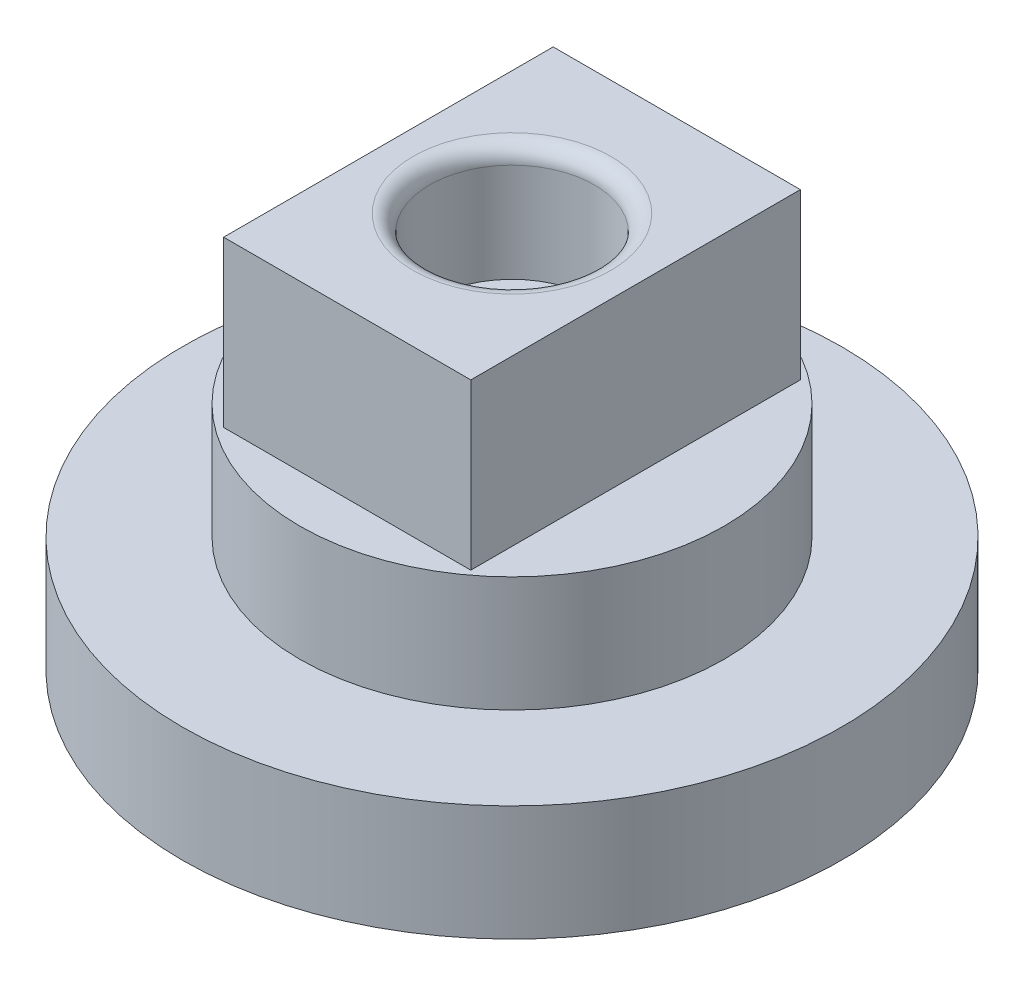
ISO-10303-21;
HEADER;
FILE_DESCRIPTION(('STEP AP214'),'2;1');
FILE_NAME('part.step','',(''),(''),'','','');
FILE_SCHEMA(('AUTOMOTIVE_DESIGN { 1 0 10303 214 1 1 1 1 }'));
ENDSEC;
DATA;
#1=APPLICATION_CONTEXT('core data for automotive mechanical design processes');
#2=APPLICATION_PROTOCOL_DEFINITION('international standard','automotive_design',2000,#1);
#3=PRODUCT_CONTEXT('',#1,'mechanical');
#4=PRODUCT('Part','Part','',(#3));
#5=PRODUCT_RELATED_PRODUCT_CATEGORY('part','',(#4));
#6=PRODUCT_DEFINITION_FORMATION('','',#4);
#7=PRODUCT_DEFINITION_CONTEXT('part definition',#1,'design');
#8=PRODUCT_DEFINITION('design','',#6,#7);
#9=PRODUCT_DEFINITION_SHAPE('','',#8);
#10=(LENGTH_UNIT() NAMED_UNIT(*) SI_UNIT(.MILLI.,.METRE.));
#11=(NAMED_UNIT(*) PLANE_ANGLE_UNIT() SI_UNIT($,.RADIAN.));
#12=(NAMED_UNIT(*) SI_UNIT($,.STERADIAN.) SOLID_ANGLE_UNIT());
#13=UNCERTAINTY_MEASURE_WITH_UNIT(LENGTH_MEASURE(1.E-05),#10,'distance_accuracy_value','');
#14=(GEOMETRIC_REPRESENTATION_CONTEXT(3) GLOBAL_UNCERTAINTY_ASSIGNED_CONTEXT((#13)) GLOBAL_UNIT_ASSIGNED_CONTEXT((#10,
#11,#12)) REPRESENTATION_CONTEXT('',''));
#15=CARTESIAN_POINT('',(0.,0.,0.));
#16=DIRECTION('',(0.,0.,1.));
#17=DIRECTION('',(1.,0.,0.));
#18=AXIS2_PLACEMENT_3D('',#15,#16,#17);
#19=CARTESIAN_POINT('',(0.,7.,0.));
#20=DIRECTION('',(0.,-1.,0.));
#21=DIRECTION('',(0.,0.,-1.));
#22=AXIS2_PLACEMENT_3D('',#19,#20,#21);
#23=CYLINDRICAL_SURFACE('',#22,20.);
#24=CARTESIAN_POINT('',(0.,7.,0.));
#25=DIRECTION('',(0.,1.,0.));
#26=DIRECTION('',(0.,0.,1.));
#27=AXIS2_PLACEMENT_3D('',#24,#25,#26);
#28=CIRCLE('',#27,20.);
#29=CARTESIAN_POINT('',(0.,7.,20.));
#30=VERTEX_POINT('',#29);
#31=EDGE_CURVE('E115',#30,#30,#28,.T.);
#32=ORIENTED_EDGE('',*,*,#31,.F.);
#33=EDGE_LOOP('',(#32));
#34=FACE_BOUND('',#33,.T.);
#35=CARTESIAN_POINT('',(0.,0.,0.));
#36=DIRECTION('',(0.,1.,0.));
#37=DIRECTION('',(0.,0.,1.));
#38=AXIS2_PLACEMENT_3D('',#35,#36,#37);
#39=CIRCLE('',#38,20.);
#40=CARTESIAN_POINT('',(0.,0.,20.));
#41=VERTEX_POINT('',#40);
#42=EDGE_CURVE('E106',#41,#41,#39,.T.);
#43=ORIENTED_EDGE('',*,*,#42,.T.);
#44=EDGE_LOOP('',(#43));
#45=FACE_BOUND('',#44,.T.);
#46=ADVANCED_FACE('F42',(#34,#45),#23,.T.);
#47=CARTESIAN_POINT('',(0.,7.,0.));
#48=DIRECTION('',(0.,1.,0.));
#49=DIRECTION('',(0.,0.,1.));
#50=AXIS2_PLACEMENT_3D('',#47,#48,#49);
#51=PLANE('',#50);
#52=CARTESIAN_POINT('',(0.,7.,0.));
#53=DIRECTION('',(0.,1.,0.));
#54=DIRECTION('',(0.,0.,1.));
#55=AXIS2_PLACEMENT_3D('',#52,#53,#54);
#56=CIRCLE('',#55,12.875);
#57=CARTESIAN_POINT('',(0.,7.,12.875));
#58=VERTEX_POINT('',#57);
#59=EDGE_CURVE('E112',#58,#58,#56,.T.);
#60=ORIENTED_EDGE('',*,*,#59,.F.);
#61=EDGE_LOOP('',(#60));
#62=FACE_BOUND('',#61,.T.);
#63=ORIENTED_EDGE('',*,*,#31,.T.);
#64=EDGE_LOOP('',(#63));
#65=FACE_BOUND('',#64,.T.);
#66=ADVANCED_FACE('F140',(#62,#65),#51,.T.);
#67=CARTESIAN_POINT('',(0.,0.,0.));
#68=DIRECTION('',(0.,1.,0.));
#69=DIRECTION('',(0.,0.,1.));
#70=AXIS2_PLACEMENT_3D('',#67,#68,#69);
#71=PLANE('',#70);
#72=CARTESIAN_POINT('',(0.,0.,15.));
#73=DIRECTION('',(0.,-1.,0.));
#74=DIRECTION('',(0.,0.,-1.));
#75=AXIS2_PLACEMENT_3D('',#72,#73,#74);
#76=CIRCLE('',#75,3.5);
#77=CARTESIAN_POINT('',(0.,0.,11.5));
#78=VERTEX_POINT('',#77);
#79=EDGE_CURVE('E210',#78,#78,#76,.T.);
#80=ORIENTED_EDGE('',*,*,#79,.F.);
#81=EDGE_LOOP('',(#80));
#82=FACE_BOUND('',#81,.T.);
#83=CARTESIAN_POINT('',(12.9903810567665,0.,-7.50000000000006));
#84=DIRECTION('',(0.,-1.,0.));
#85=DIRECTION('',(0.,0.,-1.));
#86=AXIS2_PLACEMENT_3D('',#83,#84,#85);
#87=CIRCLE('',#86,3.5);
#88=CARTESIAN_POINT('',(12.9903810567665,0.,-11.0000000000001));
#89=VERTEX_POINT('',#88);
#90=EDGE_CURVE('E216',#89,#89,#87,.T.);
#91=ORIENTED_EDGE('',*,*,#90,.F.);
#92=EDGE_LOOP('',(#91));
#93=FACE_BOUND('',#92,.T.);
#94=CARTESIAN_POINT('',(-12.9903810567667,0.,-7.49999999999988));
#95=DIRECTION('',(0.,-1.,0.));
#96=DIRECTION('',(0.,0.,-1.));
#97=AXIS2_PLACEMENT_3D('',#94,#95,#96);
#98=CIRCLE('',#97,3.5);
#99=CARTESIAN_POINT('',(-12.9903810567667,0.,-10.9999999999999));
#100=VERTEX_POINT('',#99);
#101=EDGE_CURVE('E224',#100,#100,#98,.T.);
#102=ORIENTED_EDGE('',*,*,#101,.F.);
#103=EDGE_LOOP('',(#102));
#104=FACE_BOUND('',#103,.T.);
#105=CARTESIAN_POINT('',(0.,0.,0.));
#106=DIRECTION('',(0.,-1.,0.));
#107=DIRECTION('',(0.,0.,-1.));
#108=AXIS2_PLACEMENT_3D('',#105,#106,#107);
#109=CIRCLE('',#108,5.);
#110=CARTESIAN_POINT('',(0.,0.,-5.));
#111=VERTEX_POINT('',#110);
#112=EDGE_CURVE('E209',#111,#111,#109,.T.);
#113=ORIENTED_EDGE('',*,*,#112,.F.);
#114=EDGE_LOOP('',(#113));
#115=FACE_BOUND('',#114,.T.);
#116=ORIENTED_EDGE('',*,*,#42,.F.);
#117=EDGE_LOOP('',(#116));
#118=FACE_BOUND('',#117,.T.);
#119=ADVANCED_FACE('F145',(#82,#93,#104,#115,#118),#71,.F.);
#120=CARTESIAN_POINT('',(0.,14.,0.));
#121=DIRECTION('',(0.,-1.,0.));
#122=DIRECTION('',(0.,0.,-1.));
#123=AXIS2_PLACEMENT_3D('',#120,#121,#122);
#124=CYLINDRICAL_SURFACE('',#123,12.875);
#125=CARTESIAN_POINT('',(0.,14.,0.));
#126=DIRECTION('',(0.,1.,0.));
#127=DIRECTION('',(0.,0.,1.));
#128=AXIS2_PLACEMENT_3D('',#125,#126,#127);
#129=CIRCLE('',#128,12.875);
#130=CARTESIAN_POINT('',(0.,14.,12.875));
#131=VERTEX_POINT('',#130);
#132=EDGE_CURVE('E103',#131,#131,#129,.T.);
#133=ORIENTED_EDGE('',*,*,#132,.F.);
#134=EDGE_LOOP('',(#133));
#135=FACE_BOUND('',#134,.T.);
#136=ORIENTED_EDGE('',*,*,#59,.T.);
#137=EDGE_LOOP('',(#136));
#138=FACE_BOUND('',#137,.T.);
#139=ADVANCED_FACE('F152',(#135,#138),#124,.T.);
#140=CARTESIAN_POINT('',(0.,14.,0.));
#141=DIRECTION('',(0.,1.,0.));
#142=DIRECTION('',(0.,0.,1.));
#143=AXIS2_PLACEMENT_3D('',#140,#141,#142);
#144=PLANE('',#143);
#145=DIRECTION('',(0.,0.,1.));
#146=VECTOR('',#145,1.);
#147=CARTESIAN_POINT('',(-7.5,14.,-10.));
#148=LINE('',#147,#146);
#149=CARTESIAN_POINT('',(-7.5,14.,-10.));
#150=VERTEX_POINT('',#149);
#151=CARTESIAN_POINT('',(-7.5,14.,10.));
#152=VERTEX_POINT('',#151);
#153=EDGE_CURVE('E57',#150,#152,#148,.T.);
#154=ORIENTED_EDGE('',*,*,#153,.F.);
#155=DIRECTION('',(-1.,0.,0.));
#156=VECTOR('',#155,1.);
#157=CARTESIAN_POINT('',(-7.5,14.,-10.));
#158=LINE('',#157,#156);
#159=CARTESIAN_POINT('',(7.5,14.,-10.));
#160=VERTEX_POINT('',#159);
#161=EDGE_CURVE('E61',#160,#150,#158,.T.);
#162=ORIENTED_EDGE('',*,*,#161,.F.);
#163=DIRECTION('',(0.,0.,-1.));
#164=VECTOR('',#163,1.);
#165=CARTESIAN_POINT('',(7.5,14.,-10.));
#166=LINE('',#165,#164);
#167=CARTESIAN_POINT('',(7.5,14.,10.));
#168=VERTEX_POINT('',#167);
#169=EDGE_CURVE('E241',#168,#160,#166,.T.);
#170=ORIENTED_EDGE('',*,*,#169,.F.);
#171=DIRECTION('',(1.,0.,0.));
#172=VECTOR('',#171,1.);
#173=CARTESIAN_POINT('',(-7.5,14.,10.));
#174=LINE('',#173,#172);
#175=EDGE_CURVE('E239',#152,#168,#174,.T.);
#176=ORIENTED_EDGE('',*,*,#175,.F.);
#177=EDGE_LOOP('',(#154,#162,#170,#176));
#178=FACE_BOUND('',#177,.T.);
#179=ORIENTED_EDGE('',*,*,#132,.T.);
#180=EDGE_LOOP('',(#179));
#181=FACE_BOUND('',#180,.T.);
#182=ADVANCED_FACE('F157',(#178,#181),#144,.T.);
#183=CARTESIAN_POINT('',(-7.5,24.,-10.));
#184=DIRECTION('',(1.,0.,0.));
#185=DIRECTION('',(0.,0.,-1.));
#186=AXIS2_PLACEMENT_3D('',#183,#184,#185);
#187=PLANE('',#186);
#188=ORIENTED_EDGE('',*,*,#153,.T.);
#189=DIRECTION('',(0.,-1.,0.));
#190=VECTOR('',#189,1.);
#191=CARTESIAN_POINT('',(-7.5,24.,10.));
#192=LINE('',#191,#190);
#193=CARTESIAN_POINT('',(-7.5,24.,10.));
#194=VERTEX_POINT('',#193);
#195=EDGE_CURVE('E86',#194,#152,#192,.T.);
#196=ORIENTED_EDGE('',*,*,#195,.F.);
#197=DIRECTION('',(0.,0.,1.));
#198=VECTOR('',#197,1.);
#199=CARTESIAN_POINT('',(-7.5,24.,-10.));
#200=LINE('',#199,#198);
#201=CARTESIAN_POINT('',(-7.5,24.,-10.));
#202=VERTEX_POINT('',#201);
#203=EDGE_CURVE('E92',#202,#194,#200,.T.);
#204=ORIENTED_EDGE('',*,*,#203,.F.);
#205=DIRECTION('',(0.,-1.,0.));
#206=VECTOR('',#205,1.);
#207=CARTESIAN_POINT('',(-7.5,24.,-10.));
#208=LINE('',#207,#206);
#209=EDGE_CURVE('E237',#202,#150,#208,.T.);
#210=ORIENTED_EDGE('',*,*,#209,.T.);
#211=EDGE_LOOP('',(#188,#196,#204,#210));
#212=FACE_BOUND('',#211,.T.);
#213=ADVANCED_FACE('F102',(#212),#187,.F.);
#214=CARTESIAN_POINT('',(-7.5,24.,10.));
#215=DIRECTION('',(0.,0.,-1.));
#216=DIRECTION('',(-1.,0.,0.));
#217=AXIS2_PLACEMENT_3D('',#214,#215,#216);
#218=PLANE('',#217);
#219=ORIENTED_EDGE('',*,*,#175,.T.);
#220=DIRECTION('',(0.,-1.,0.));
#221=VECTOR('',#220,1.);
#222=CARTESIAN_POINT('',(7.5,24.,10.));
#223=LINE('',#222,#221);
#224=CARTESIAN_POINT('',(7.5,24.,10.));
#225=VERTEX_POINT('',#224);
#226=EDGE_CURVE('E88',#225,#168,#223,.T.);
#227=ORIENTED_EDGE('',*,*,#226,.F.);
#228=DIRECTION('',(1.,0.,0.));
#229=VECTOR('',#228,1.);
#230=CARTESIAN_POINT('',(-7.5,24.,10.));
#231=LINE('',#230,#229);
#232=EDGE_CURVE('E81',#194,#225,#231,.T.);
#233=ORIENTED_EDGE('',*,*,#232,.F.);
#234=ORIENTED_EDGE('',*,*,#195,.T.);
#235=EDGE_LOOP('',(#219,#227,#233,#234));
#236=FACE_BOUND('',#235,.T.);
#237=ADVANCED_FACE('F84',(#236),#218,.F.);
#238=CARTESIAN_POINT('',(7.5,24.,-10.));
#239=DIRECTION('',(-1.,0.,0.));
#240=DIRECTION('',(0.,0.,1.));
#241=AXIS2_PLACEMENT_3D('',#238,#239,#240);
#242=PLANE('',#241);
#243=ORIENTED_EDGE('',*,*,#169,.T.);
#244=DIRECTION('',(0.,-1.,0.));
#245=VECTOR('',#244,1.);
#246=CARTESIAN_POINT('',(7.5,24.,-10.));
#247=LINE('',#246,#245);
#248=CARTESIAN_POINT('',(7.5,24.,-10.));
#249=VERTEX_POINT('',#248);
#250=EDGE_CURVE('E108',#249,#160,#247,.T.);
#251=ORIENTED_EDGE('',*,*,#250,.F.);
#252=DIRECTION('',(0.,0.,-1.));
#253=VECTOR('',#252,1.);
#254=CARTESIAN_POINT('',(7.5,24.,-10.));
#255=LINE('',#254,#253);
#256=EDGE_CURVE('E91',#225,#249,#255,.T.);
#257=ORIENTED_EDGE('',*,*,#256,.F.);
#258=ORIENTED_EDGE('',*,*,#226,.T.);
#259=EDGE_LOOP('',(#243,#251,#257,#258));
#260=FACE_BOUND('',#259,.T.);
#261=ADVANCED_FACE('F165',(#260),#242,.F.);
#262=CARTESIAN_POINT('',(-7.5,24.,-10.));
#263=DIRECTION('',(0.,0.,1.));
#264=DIRECTION('',(1.,0.,0.));
#265=AXIS2_PLACEMENT_3D('',#262,#263,#264);
#266=PLANE('',#265);
#267=ORIENTED_EDGE('',*,*,#161,.T.);
#268=ORIENTED_EDGE('',*,*,#209,.F.);
#269=DIRECTION('',(-1.,0.,0.));
#270=VECTOR('',#269,1.);
#271=CARTESIAN_POINT('',(-7.5,24.,-10.));
#272=LINE('',#271,#270);
#273=EDGE_CURVE('E97',#249,#202,#272,.T.);
#274=ORIENTED_EDGE('',*,*,#273,.F.);
#275=ORIENTED_EDGE('',*,*,#250,.T.);
#276=EDGE_LOOP('',(#267,#268,#274,#275));
#277=FACE_BOUND('',#276,.T.);
#278=ADVANCED_FACE('F168',(#277),#266,.F.);
#279=CARTESIAN_POINT('',(0.,24.,0.));
#280=DIRECTION('',(0.,1.,0.));
#281=DIRECTION('',(0.,0.,1.));
#282=AXIS2_PLACEMENT_3D('',#279,#280,#281);
#283=PLANE('',#282);
#284=CARTESIAN_POINT('',(0.,24.,0.));
#285=DIRECTION('',(0.,1.,0.));
#286=DIRECTION('',(0.,0.,1.));
#287=AXIS2_PLACEMENT_3D('',#284,#285,#286);
#288=CIRCLE('',#287,6.);
#289=CARTESIAN_POINT('',(0.,24.,6.));
#290=VERTEX_POINT('',#289);
#291=EDGE_CURVE('E11',#290,#290,#288,.F.);
#292=ORIENTED_EDGE('',*,*,#291,.T.);
#293=EDGE_LOOP('',(#292));
#294=FACE_BOUND('',#293,.T.);
#295=ORIENTED_EDGE('',*,*,#203,.T.);
#296=ORIENTED_EDGE('',*,*,#232,.T.);
#297=ORIENTED_EDGE('',*,*,#256,.T.);
#298=ORIENTED_EDGE('',*,*,#273,.T.);
#299=EDGE_LOOP('',(#295,#296,#297,#298));
#300=FACE_BOUND('',#299,.T.);
#301=ADVANCED_FACE('F95',(#294,#300),#283,.T.);
#302=CARTESIAN_POINT('',(0.,17.,0.));
#303=DIRECTION('',(0.,1.,0.));
#304=DIRECTION('',(0.,0.,1.));
#305=AXIS2_PLACEMENT_3D('',#302,#303,#304);
#306=CYLINDRICAL_SURFACE('',#305,5.);
#307=CARTESIAN_POINT('',(0.,23.,0.));
#308=DIRECTION('',(0.,1.,0.));
#309=DIRECTION('',(0.,0.,1.));
#310=AXIS2_PLACEMENT_3D('',#307,#308,#309);
#311=CIRCLE('',#310,5.);
#312=CARTESIAN_POINT('',(0.,23.,5.));
#313=VERTEX_POINT('',#312);
#314=EDGE_CURVE('E50',#313,#313,#311,.T.);
#315=ORIENTED_EDGE('',*,*,#314,.T.);
#316=EDGE_LOOP('',(#315));
#317=FACE_BOUND('',#316,.T.);
#318=CARTESIAN_POINT('',(0.,17.,0.));
#319=DIRECTION('',(0.,1.,0.));
#320=DIRECTION('',(0.,0.,1.));
#321=AXIS2_PLACEMENT_3D('',#318,#319,#320);
#322=CIRCLE('',#321,5.);
#323=CARTESIAN_POINT('',(0.,17.,5.));
#324=VERTEX_POINT('',#323);
#325=EDGE_CURVE('E231',#324,#324,#322,.T.);
#326=ORIENTED_EDGE('',*,*,#325,.F.);
#327=EDGE_LOOP('',(#326));
#328=FACE_BOUND('',#327,.T.);
#329=ADVANCED_FACE('F122',(#317,#328),#306,.F.);
#330=CARTESIAN_POINT('',(0.,17.,0.));
#331=DIRECTION('',(0.,1.,0.));
#332=DIRECTION('',(0.,0.,1.));
#333=AXIS2_PLACEMENT_3D('',#330,#331,#332);
#334=PLANE('',#333);
#335=ORIENTED_EDGE('',*,*,#325,.T.);
#336=EDGE_LOOP('',(#335));
#337=FACE_BOUND('',#336,.T.);
#338=ADVANCED_FACE('F127',(#337),#334,.T.);
#339=CARTESIAN_POINT('',(0.,23.,0.));
#340=DIRECTION('',(0.,1.,0.));
#341=DIRECTION('',(0.,0.,1.));
#342=AXIS2_PLACEMENT_3D('',#339,#340,#341);
#343=TOROIDAL_SURFACE('',#342,6.,1.);
#344=ORIENTED_EDGE('',*,*,#291,.F.);
#345=EDGE_LOOP('',(#344));
#346=FACE_BOUND('',#345,.T.);
#347=ORIENTED_EDGE('',*,*,#314,.F.);
#348=EDGE_LOOP('',(#347));
#349=FACE_BOUND('',#348,.T.);
#350=ADVANCED_FACE('F44',(#346,#349),#343,.T.);
#351=CARTESIAN_POINT('',(0.,3.,0.));
#352=DIRECTION('',(0.,-1.,0.));
#353=DIRECTION('',(0.,0.,-1.));
#354=AXIS2_PLACEMENT_3D('',#351,#352,#353);
#355=CYLINDRICAL_SURFACE('',#354,5.);
#356=CARTESIAN_POINT('',(0.,3.,0.));
#357=DIRECTION('',(0.,-1.,0.));
#358=DIRECTION('',(0.,0.,-1.));
#359=AXIS2_PLACEMENT_3D('',#356,#357,#358);
#360=CIRCLE('',#359,5.);
#361=CARTESIAN_POINT('',(0.,3.,-5.));
#362=VERTEX_POINT('',#361);
#363=EDGE_CURVE('E213',#362,#362,#360,.T.);
#364=ORIENTED_EDGE('',*,*,#363,.F.);
#365=EDGE_LOOP('',(#364));
#366=FACE_BOUND('',#365,.T.);
#367=ORIENTED_EDGE('',*,*,#112,.T.);
#368=EDGE_LOOP('',(#367));
#369=FACE_BOUND('',#368,.T.);
#370=ADVANCED_FACE('F126',(#366,#369),#355,.F.);
#371=CARTESIAN_POINT('',(0.,3.,0.));
#372=DIRECTION('',(0.,-1.,0.));
#373=DIRECTION('',(0.,0.,-1.));
#374=AXIS2_PLACEMENT_3D('',#371,#372,#373);
#375=PLANE('',#374);
#376=ORIENTED_EDGE('',*,*,#363,.T.);
#377=EDGE_LOOP('',(#376));
#378=FACE_BOUND('',#377,.T.);
#379=ADVANCED_FACE('F133',(#378),#375,.T.);
#380=CARTESIAN_POINT('',(-12.9903810567667,5.,-7.49999999999988));
#381=DIRECTION('',(0.,-1.,0.));
#382=DIRECTION('',(0.,0.,-1.));
#383=AXIS2_PLACEMENT_3D('',#380,#381,#382);
#384=CYLINDRICAL_SURFACE('',#383,3.5);
#385=CARTESIAN_POINT('',(-12.9903810567667,5.,-7.49999999999988));
#386=DIRECTION('',(0.,-1.,0.));
#387=DIRECTION('',(0.,0.,-1.));
#388=AXIS2_PLACEMENT_3D('',#385,#386,#387);
#389=CIRCLE('',#388,3.5);
#390=CARTESIAN_POINT('',(-12.9903810567667,5.,-10.9999999999999));
#391=VERTEX_POINT('',#390);
#392=EDGE_CURVE('E227',#391,#391,#389,.T.);
#393=ORIENTED_EDGE('',*,*,#392,.F.);
#394=EDGE_LOOP('',(#393));
#395=FACE_BOUND('',#394,.T.);
#396=ORIENTED_EDGE('',*,*,#101,.T.);
#397=EDGE_LOOP('',(#396));
#398=FACE_BOUND('',#397,.T.);
#399=ADVANCED_FACE('F180',(#395,#398),#384,.F.);
#400=CARTESIAN_POINT('',(-12.9903810567667,5.,-7.49999999999988));
#401=DIRECTION('',(0.,-1.,0.));
#402=DIRECTION('',(0.,0.,-1.));
#403=AXIS2_PLACEMENT_3D('',#400,#401,#402);
#404=PLANE('',#403);
#405=ORIENTED_EDGE('',*,*,#392,.T.);
#406=EDGE_LOOP('',(#405));
#407=FACE_BOUND('',#406,.T.);
#408=ADVANCED_FACE('F182',(#407),#404,.T.);
#409=CARTESIAN_POINT('',(12.9903810567665,5.,-7.50000000000006));
#410=DIRECTION('',(0.,-1.,0.));
#411=DIRECTION('',(0.,0.,-1.));
#412=AXIS2_PLACEMENT_3D('',#409,#410,#411);
#413=CYLINDRICAL_SURFACE('',#412,3.5);
#414=CARTESIAN_POINT('',(12.9903810567665,5.,-7.50000000000006));
#415=DIRECTION('',(0.,-1.,0.));
#416=DIRECTION('',(0.,0.,-1.));
#417=AXIS2_PLACEMENT_3D('',#414,#415,#416);
#418=CIRCLE('',#417,3.5);
#419=CARTESIAN_POINT('',(12.9903810567665,5.,-11.0000000000001));
#420=VERTEX_POINT('',#419);
#421=EDGE_CURVE('E221',#420,#420,#418,.T.);
#422=ORIENTED_EDGE('',*,*,#421,.F.);
#423=EDGE_LOOP('',(#422));
#424=FACE_BOUND('',#423,.T.);
#425=ORIENTED_EDGE('',*,*,#90,.T.);
#426=EDGE_LOOP('',(#425));
#427=FACE_BOUND('',#426,.T.);
#428=ADVANCED_FACE('F185',(#424,#427),#413,.F.);
#429=CARTESIAN_POINT('',(12.9903810567665,5.,-7.50000000000006));
#430=DIRECTION('',(0.,-1.,0.));
#431=DIRECTION('',(0.,0.,-1.));
#432=AXIS2_PLACEMENT_3D('',#429,#430,#431);
#433=PLANE('',#432);
#434=ORIENTED_EDGE('',*,*,#421,.T.);
#435=EDGE_LOOP('',(#434));
#436=FACE_BOUND('',#435,.T.);
#437=ADVANCED_FACE('F190',(#436),#433,.T.);
#438=CARTESIAN_POINT('',(0.,5.,15.));
#439=DIRECTION('',(0.,-1.,0.));
#440=DIRECTION('',(0.,0.,-1.));
#441=AXIS2_PLACEMENT_3D('',#438,#439,#440);
#442=CYLINDRICAL_SURFACE('',#441,3.5);
#443=CARTESIAN_POINT('',(0.,5.,15.));
#444=DIRECTION('',(0.,-1.,0.));
#445=DIRECTION('',(0.,0.,-1.));
#446=AXIS2_PLACEMENT_3D('',#443,#444,#445);
#447=CIRCLE('',#446,3.5);
#448=CARTESIAN_POINT('',(0.,5.,11.5));
#449=VERTEX_POINT('',#448);
#450=EDGE_CURVE('E208',#449,#449,#447,.T.);
#451=ORIENTED_EDGE('',*,*,#450,.F.);
#452=EDGE_LOOP('',(#451));
#453=FACE_BOUND('',#452,.T.);
#454=ORIENTED_EDGE('',*,*,#79,.T.);
#455=EDGE_LOOP('',(#454));
#456=FACE_BOUND('',#455,.T.);
#457=ADVANCED_FACE('F193',(#453,#456),#442,.F.);
#458=CARTESIAN_POINT('',(0.,5.,15.));
#459=DIRECTION('',(0.,-1.,0.));
#460=DIRECTION('',(0.,0.,-1.));
#461=AXIS2_PLACEMENT_3D('',#458,#459,#460);
#462=PLANE('',#461);
#463=ORIENTED_EDGE('',*,*,#450,.T.);
#464=EDGE_LOOP('',(#463));
#465=FACE_BOUND('',#464,.T.);
#466=ADVANCED_FACE('F200',(#465),#462,.T.);
#467=CLOSED_SHELL('',(#46,#66,#119,#139,#182,#213,#237,#261,#278,#301,#329,#338,#350,#370,#379,
#399,#408,#428,#437,#457,#466));
#468=MANIFOLD_SOLID_BREP('B2',#467);
#469=ADVANCED_BREP_SHAPE_REPRESENTATION('',(#18,#468),#14);
#470=SHAPE_DEFINITION_REPRESENTATION(#9,#469);
ENDSEC;
END-ISO-10303-21;
